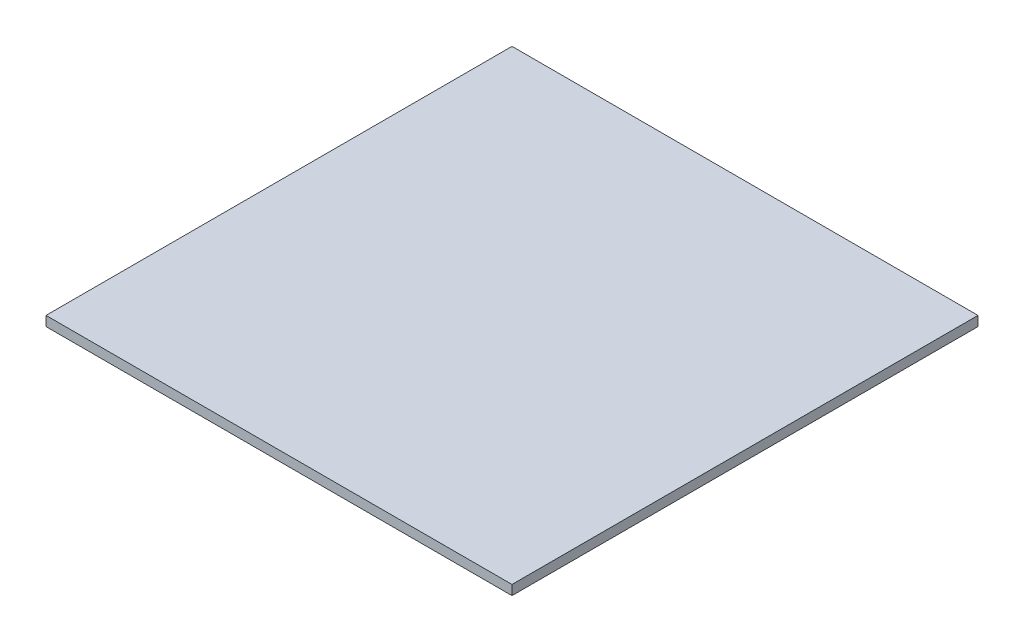
ISO-10303-21;
HEADER;
FILE_DESCRIPTION(('STEP AP214'),'2;1');
FILE_NAME('part.step','',(''),(''),'','','');
FILE_SCHEMA(('AUTOMOTIVE_DESIGN { 1 0 10303 214 1 1 1 1 }'));
ENDSEC;
DATA;
#1=APPLICATION_CONTEXT('core data for automotive mechanical design processes');
#2=APPLICATION_PROTOCOL_DEFINITION('international standard','automotive_design',2000,#1);
#3=PRODUCT_CONTEXT('',#1,'mechanical');
#4=PRODUCT('Part','Part','',(#3));
#5=PRODUCT_RELATED_PRODUCT_CATEGORY('part','',(#4));
#6=PRODUCT_DEFINITION_FORMATION('','',#4);
#7=PRODUCT_DEFINITION_CONTEXT('part definition',#1,'design');
#8=PRODUCT_DEFINITION('design','',#6,#7);
#9=PRODUCT_DEFINITION_SHAPE('','',#8);
#10=(LENGTH_UNIT() NAMED_UNIT(*) SI_UNIT(.MILLI.,.METRE.));
#11=(NAMED_UNIT(*) PLANE_ANGLE_UNIT() SI_UNIT($,.RADIAN.));
#12=(NAMED_UNIT(*) SI_UNIT($,.STERADIAN.) SOLID_ANGLE_UNIT());
#13=UNCERTAINTY_MEASURE_WITH_UNIT(LENGTH_MEASURE(1.E-05),#10,'distance_accuracy_value','');
#14=(GEOMETRIC_REPRESENTATION_CONTEXT(3) GLOBAL_UNCERTAINTY_ASSIGNED_CONTEXT((#13)) GLOBAL_UNIT_ASSIGNED_CONTEXT((#10,
#11,#12)) REPRESENTATION_CONTEXT('',''));
#15=CARTESIAN_POINT('',(0.,0.,0.));
#16=DIRECTION('',(0.,0.,1.));
#17=DIRECTION('',(1.,0.,0.));
#18=AXIS2_PLACEMENT_3D('',#15,#16,#17);
#19=CARTESIAN_POINT('',(48.,2.,48.));
#20=DIRECTION('',(0.,0.,-1.));
#21=DIRECTION('',(-1.,0.,0.));
#22=AXIS2_PLACEMENT_3D('',#19,#20,#21);
#23=PLANE('',#22);
#24=DIRECTION('',(1.,0.,0.));
#25=VECTOR('',#24,1.);
#26=CARTESIAN_POINT('',(48.,0.,48.));
#27=LINE('',#26,#25);
#28=CARTESIAN_POINT('',(-48.,0.,48.));
#29=VERTEX_POINT('',#28);
#30=CARTESIAN_POINT('',(48.,0.,48.));
#31=VERTEX_POINT('',#30);
#32=EDGE_CURVE('E107',#29,#31,#27,.T.);
#33=ORIENTED_EDGE('',*,*,#32,.T.);
#34=DIRECTION('',(0.,-1.,0.));
#35=VECTOR('',#34,1.);
#36=CARTESIAN_POINT('',(48.,2.,48.));
#37=LINE('',#36,#35);
#38=CARTESIAN_POINT('',(48.,2.,48.));
#39=VERTEX_POINT('',#38);
#40=EDGE_CURVE('E11',#39,#31,#37,.T.);
#41=ORIENTED_EDGE('',*,*,#40,.F.);
#42=DIRECTION('',(1.,0.,0.));
#43=VECTOR('',#42,1.);
#44=CARTESIAN_POINT('',(48.,2.,48.));
#45=LINE('',#44,#43);
#46=CARTESIAN_POINT('',(-48.,2.,48.));
#47=VERTEX_POINT('',#46);
#48=EDGE_CURVE('E91',#47,#39,#45,.T.);
#49=ORIENTED_EDGE('',*,*,#48,.F.);
#50=DIRECTION('',(0.,-1.,0.));
#51=VECTOR('',#50,1.);
#52=CARTESIAN_POINT('',(-48.,2.,48.));
#53=LINE('',#52,#51);
#54=EDGE_CURVE('E103',#47,#29,#53,.T.);
#55=ORIENTED_EDGE('',*,*,#54,.T.);
#56=EDGE_LOOP('',(#33,#41,#49,#55));
#57=FACE_BOUND('',#56,.T.);
#58=ADVANCED_FACE('F39',(#57),#23,.F.);
#59=CARTESIAN_POINT('',(48.,2.,-48.));
#60=DIRECTION('',(-1.,0.,0.));
#61=DIRECTION('',(0.,0.,1.));
#62=AXIS2_PLACEMENT_3D('',#59,#60,#61);
#63=PLANE('',#62);
#64=DIRECTION('',(0.,0.,-1.));
#65=VECTOR('',#64,1.);
#66=CARTESIAN_POINT('',(48.,0.,-48.));
#67=LINE('',#66,#65);
#68=CARTESIAN_POINT('',(48.,0.,-48.));
#69=VERTEX_POINT('',#68);
#70=EDGE_CURVE('E96',#31,#69,#67,.T.);
#71=ORIENTED_EDGE('',*,*,#70,.T.);
#72=DIRECTION('',(0.,-1.,0.));
#73=VECTOR('',#72,1.);
#74=CARTESIAN_POINT('',(48.,2.,-48.));
#75=LINE('',#74,#73);
#76=CARTESIAN_POINT('',(48.,2.,-48.));
#77=VERTEX_POINT('',#76);
#78=EDGE_CURVE('E48',#77,#69,#75,.T.);
#79=ORIENTED_EDGE('',*,*,#78,.F.);
#80=DIRECTION('',(0.,0.,-1.));
#81=VECTOR('',#80,1.);
#82=CARTESIAN_POINT('',(48.,2.,-48.));
#83=LINE('',#82,#81);
#84=EDGE_CURVE('E86',#39,#77,#83,.T.);
#85=ORIENTED_EDGE('',*,*,#84,.F.);
#86=ORIENTED_EDGE('',*,*,#40,.T.);
#87=EDGE_LOOP('',(#71,#79,#85,#86));
#88=FACE_BOUND('',#87,.T.);
#89=ADVANCED_FACE('F95',(#88),#63,.F.);
#90=CARTESIAN_POINT('',(-48.,2.,-48.));
#91=DIRECTION('',(0.,0.,1.));
#92=DIRECTION('',(1.,0.,0.));
#93=AXIS2_PLACEMENT_3D('',#90,#91,#92);
#94=PLANE('',#93);
#95=DIRECTION('',(-1.,0.,0.));
#96=VECTOR('',#95,1.);
#97=CARTESIAN_POINT('',(-48.,0.,-48.));
#98=LINE('',#97,#96);
#99=CARTESIAN_POINT('',(-48.,0.,-48.));
#100=VERTEX_POINT('',#99);
#101=EDGE_CURVE('E73',#69,#100,#98,.T.);
#102=ORIENTED_EDGE('',*,*,#101,.T.);
#103=DIRECTION('',(0.,-1.,0.));
#104=VECTOR('',#103,1.);
#105=CARTESIAN_POINT('',(-48.,2.,-48.));
#106=LINE('',#105,#104);
#107=CARTESIAN_POINT('',(-48.,2.,-48.));
#108=VERTEX_POINT('',#107);
#109=EDGE_CURVE('E98',#108,#100,#106,.T.);
#110=ORIENTED_EDGE('',*,*,#109,.F.);
#111=DIRECTION('',(-1.,0.,0.));
#112=VECTOR('',#111,1.);
#113=CARTESIAN_POINT('',(-48.,2.,-48.));
#114=LINE('',#113,#112);
#115=EDGE_CURVE('E89',#77,#108,#114,.T.);
#116=ORIENTED_EDGE('',*,*,#115,.F.);
#117=ORIENTED_EDGE('',*,*,#78,.T.);
#118=EDGE_LOOP('',(#102,#110,#116,#117));
#119=FACE_BOUND('',#118,.T.);
#120=ADVANCED_FACE('F99',(#119),#94,.F.);
#121=CARTESIAN_POINT('',(-48.,2.,48.));
#122=DIRECTION('',(1.,0.,0.));
#123=DIRECTION('',(0.,0.,-1.));
#124=AXIS2_PLACEMENT_3D('',#121,#122,#123);
#125=PLANE('',#124);
#126=DIRECTION('',(0.,0.,1.));
#127=VECTOR('',#126,1.);
#128=CARTESIAN_POINT('',(-48.,0.,48.));
#129=LINE('',#128,#127);
#130=EDGE_CURVE('E79',#100,#29,#129,.T.);
#131=ORIENTED_EDGE('',*,*,#130,.T.);
#132=ORIENTED_EDGE('',*,*,#54,.F.);
#133=DIRECTION('',(0.,0.,1.));
#134=VECTOR('',#133,1.);
#135=CARTESIAN_POINT('',(-48.,2.,48.));
#136=LINE('',#135,#134);
#137=EDGE_CURVE('E56',#108,#47,#136,.T.);
#138=ORIENTED_EDGE('',*,*,#137,.F.);
#139=ORIENTED_EDGE('',*,*,#109,.T.);
#140=EDGE_LOOP('',(#131,#132,#138,#139));
#141=FACE_BOUND('',#140,.T.);
#142=ADVANCED_FACE('F120',(#141),#125,.F.);
#143=CARTESIAN_POINT('',(0.,2.,0.));
#144=DIRECTION('',(0.,-1.,0.));
#145=DIRECTION('',(0.,0.,-1.));
#146=AXIS2_PLACEMENT_3D('',#143,#144,#145);
#147=PLANE('',#146);
#148=ORIENTED_EDGE('',*,*,#48,.T.);
#149=ORIENTED_EDGE('',*,*,#84,.T.);
#150=ORIENTED_EDGE('',*,*,#115,.T.);
#151=ORIENTED_EDGE('',*,*,#137,.T.);
#152=EDGE_LOOP('',(#148,#149,#150,#151));
#153=FACE_BOUND('',#152,.T.);
#154=ADVANCED_FACE('F87',(#153),#147,.F.);
#155=CARTESIAN_POINT('',(0.,0.,0.));
#156=DIRECTION('',(0.,-1.,0.));
#157=DIRECTION('',(0.,0.,-1.));
#158=AXIS2_PLACEMENT_3D('',#155,#156,#157);
#159=PLANE('',#158);
#160=ORIENTED_EDGE('',*,*,#32,.F.);
#161=ORIENTED_EDGE('',*,*,#130,.F.);
#162=ORIENTED_EDGE('',*,*,#101,.F.);
#163=ORIENTED_EDGE('',*,*,#70,.F.);
#164=EDGE_LOOP('',(#160,#161,#162,#163));
#165=FACE_BOUND('',#164,.T.);
#166=ADVANCED_FACE('F123',(#165),#159,.T.);
#167=CLOSED_SHELL('',(#58,#89,#120,#142,#154,#166));
#168=MANIFOLD_SOLID_BREP('B2',#167);
#169=ADVANCED_BREP_SHAPE_REPRESENTATION('',(#18,#168),#14);
#170=SHAPE_DEFINITION_REPRESENTATION(#9,#169);
ENDSEC;
END-ISO-10303-21;
